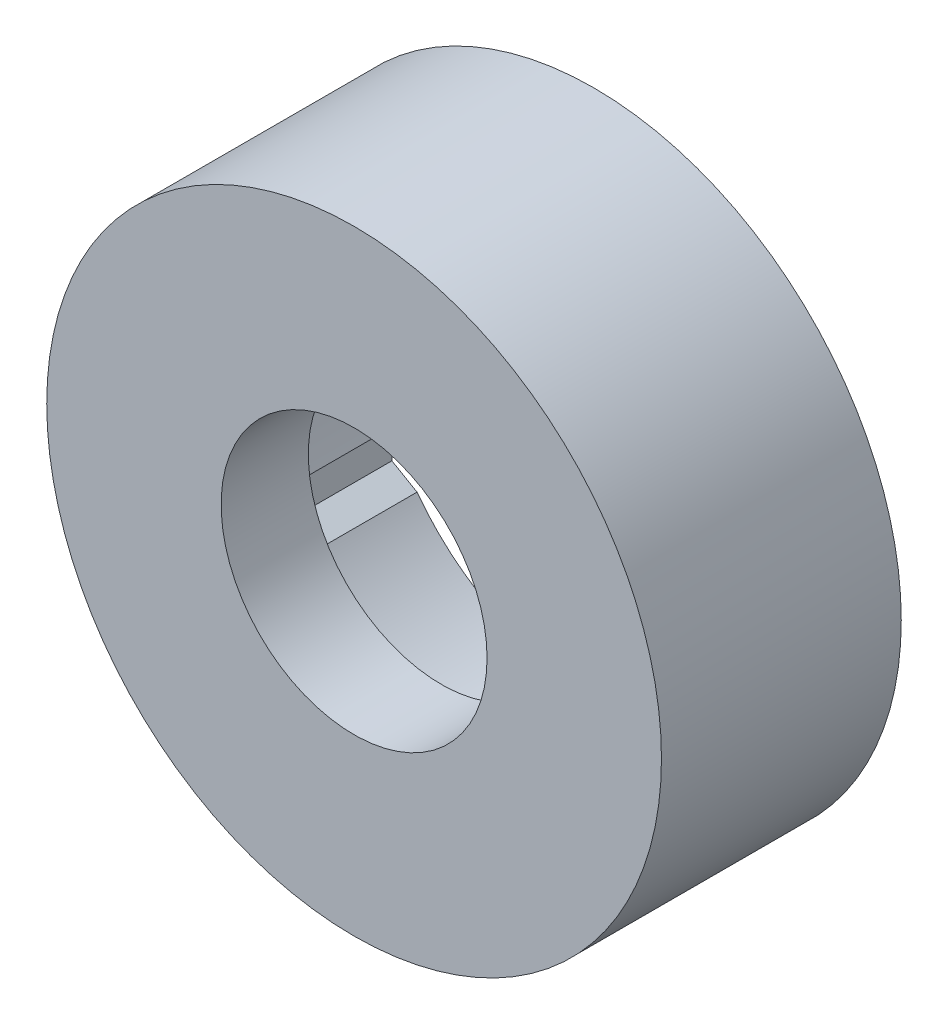
ISO-10303-21;
HEADER;
FILE_DESCRIPTION(('STEP AP214'),'2;1');
FILE_NAME('part.step','',(''),(''),'','','');
FILE_SCHEMA(('AUTOMOTIVE_DESIGN { 1 0 10303 214 1 1 1 1 }'));
ENDSEC;
DATA;
#1=APPLICATION_CONTEXT('core data for automotive mechanical design processes');
#2=APPLICATION_PROTOCOL_DEFINITION('international standard','automotive_design',2000,#1);
#3=PRODUCT_CONTEXT('',#1,'mechanical');
#4=PRODUCT('Part','Part','',(#3));
#5=PRODUCT_RELATED_PRODUCT_CATEGORY('part','',(#4));
#6=PRODUCT_DEFINITION_FORMATION('','',#4);
#7=PRODUCT_DEFINITION_CONTEXT('part definition',#1,'design');
#8=PRODUCT_DEFINITION('design','',#6,#7);
#9=PRODUCT_DEFINITION_SHAPE('','',#8);
#10=(LENGTH_UNIT() NAMED_UNIT(*) SI_UNIT(.MILLI.,.METRE.));
#11=(NAMED_UNIT(*) PLANE_ANGLE_UNIT() SI_UNIT($,.RADIAN.));
#12=(NAMED_UNIT(*) SI_UNIT($,.STERADIAN.) SOLID_ANGLE_UNIT());
#13=UNCERTAINTY_MEASURE_WITH_UNIT(LENGTH_MEASURE(1.E-05),#10,'distance_accuracy_value','');
#14=(GEOMETRIC_REPRESENTATION_CONTEXT(3) GLOBAL_UNCERTAINTY_ASSIGNED_CONTEXT((#13)) GLOBAL_UNIT_ASSIGNED_CONTEXT((#10,
#11,#12)) REPRESENTATION_CONTEXT('',''));
#15=CARTESIAN_POINT('',(0.,0.,0.));
#16=DIRECTION('',(0.,0.,1.));
#17=DIRECTION('',(1.,0.,0.));
#18=AXIS2_PLACEMENT_3D('',#15,#16,#17);
#19=CARTESIAN_POINT('',(0.,0.,-3.5));
#20=DIRECTION('',(0.,0.,1.));
#21=DIRECTION('',(1.,0.,0.));
#22=AXIS2_PLACEMENT_3D('',#19,#20,#21);
#23=CYLINDRICAL_SURFACE('',#22,5.05);
#24=CARTESIAN_POINT('',(0.,0.,-3.5));
#25=DIRECTION('',(0.,0.,1.));
#26=DIRECTION('',(1.,0.,0.));
#27=AXIS2_PLACEMENT_3D('',#24,#25,#26);
#28=CIRCLE('',#27,5.05);
#29=CARTESIAN_POINT('',(-0.57687120631193,5.01694325374807,-3.5));
#30=VERTEX_POINT('',#29);
#31=CARTESIAN_POINT('',(-4.05636470393482,3.00805674625194,-3.5));
#32=VERTEX_POINT('',#31);
#33=EDGE_CURVE('E521',#30,#32,#28,.T.);
#34=ORIENTED_EDGE('',*,*,#33,.F.);
#35=DIRECTION('',(0.,0.,-1.));
#36=VECTOR('',#35,1.);
#37=CARTESIAN_POINT('',(-0.57687120631193,5.01694325374807,1.20085317625056));
#38=LINE('',#37,#36);
#39=CARTESIAN_POINT('',(-0.57687120631193,5.01694325374807,0.));
#40=VERTEX_POINT('',#39);
#41=EDGE_CURVE('E194',#40,#30,#38,.T.);
#42=ORIENTED_EDGE('',*,*,#41,.F.);
#43=CARTESIAN_POINT('',(0.,0.,0.));
#44=DIRECTION('',(0.,0.,1.));
#45=DIRECTION('',(1.,0.,0.));
#46=AXIS2_PLACEMENT_3D('',#43,#44,#45);
#47=CIRCLE('',#46,5.05);
#48=CARTESIAN_POINT('',(-4.05636470393482,3.00805674625194,0.));
#49=VERTEX_POINT('',#48);
#50=EDGE_CURVE('E50',#40,#49,#47,.T.);
#51=ORIENTED_EDGE('',*,*,#50,.T.);
#52=DIRECTION('',(0.,0.,-1.));
#53=VECTOR('',#52,1.);
#54=CARTESIAN_POINT('',(-4.05636470393482,3.00805674625194,1.20085317625056));
#55=LINE('',#54,#53);
#56=EDGE_CURVE('E226',#49,#32,#55,.T.);
#57=ORIENTED_EDGE('',*,*,#56,.T.);
#58=EDGE_LOOP('',(#34,#42,#51,#57));
#59=FACE_BOUND('',#58,.T.);
#60=ADVANCED_FACE('F41',(#59),#23,.F.);
#61=CARTESIAN_POINT('',(-4.63323591024675,2.00888650749613,0.));
#62=VERTEX_POINT('',#61);
#63=CARTESIAN_POINT('',(-4.63323591024675,-2.00888650749613,0.));
#64=VERTEX_POINT('',#63);
#65=EDGE_CURVE('E546',#62,#64,#47,.T.);
#66=ORIENTED_EDGE('',*,*,#65,.T.);
#67=DIRECTION('',(0.,0.,-1.));
#68=VECTOR('',#67,1.);
#69=CARTESIAN_POINT('',(-4.63323591024675,-2.00888650749613,1.20085317625056));
#70=LINE('',#69,#68);
#71=CARTESIAN_POINT('',(-4.63323591024675,-2.00888650749613,-3.5));
#72=VERTEX_POINT('',#71);
#73=EDGE_CURVE('E206',#64,#72,#70,.T.);
#74=ORIENTED_EDGE('',*,*,#73,.T.);
#75=CARTESIAN_POINT('',(-4.63323591024675,2.00888650749613,-3.5));
#76=VERTEX_POINT('',#75);
#77=EDGE_CURVE('E519',#76,#72,#28,.T.);
#78=ORIENTED_EDGE('',*,*,#77,.F.);
#79=DIRECTION('',(0.,0.,-1.));
#80=VECTOR('',#79,1.);
#81=CARTESIAN_POINT('',(-4.63323591024675,2.00888650749613,1.20085317625056));
#82=LINE('',#81,#80);
#83=EDGE_CURVE('E231',#62,#76,#82,.T.);
#84=ORIENTED_EDGE('',*,*,#83,.F.);
#85=EDGE_LOOP('',(#66,#74,#78,#84));
#86=FACE_BOUND('',#85,.T.);
#87=ADVANCED_FACE('F320',(#86),#23,.F.);
#88=CARTESIAN_POINT('',(-4.05636470393482,-3.00805674625194,-3.5));
#89=VERTEX_POINT('',#88);
#90=CARTESIAN_POINT('',(-0.576871206311927,-5.01694325374807,-3.5));
#91=VERTEX_POINT('',#90);
#92=EDGE_CURVE('E514',#89,#91,#28,.T.);
#93=ORIENTED_EDGE('',*,*,#92,.F.);
#94=DIRECTION('',(0.,0.,-1.));
#95=VECTOR('',#94,1.);
#96=CARTESIAN_POINT('',(-4.05636470393482,-3.00805674625194,1.20085317625056));
#97=LINE('',#96,#95);
#98=CARTESIAN_POINT('',(-4.05636470393482,-3.00805674625194,0.));
#99=VERTEX_POINT('',#98);
#100=EDGE_CURVE('E211',#99,#89,#97,.T.);
#101=ORIENTED_EDGE('',*,*,#100,.F.);
#102=CARTESIAN_POINT('',(-0.576871206311927,-5.01694325374807,0.));
#103=VERTEX_POINT('',#102);
#104=EDGE_CURVE('E551',#99,#103,#47,.T.);
#105=ORIENTED_EDGE('',*,*,#104,.T.);
#106=DIRECTION('',(0.,0.,-1.));
#107=VECTOR('',#106,1.);
#108=CARTESIAN_POINT('',(-0.576871206311927,-5.01694325374807,1.20085317625056));
#109=LINE('',#108,#107);
#110=EDGE_CURVE('E278',#103,#91,#109,.T.);
#111=ORIENTED_EDGE('',*,*,#110,.T.);
#112=EDGE_LOOP('',(#93,#101,#105,#111));
#113=FACE_BOUND('',#112,.T.);
#114=ADVANCED_FACE('F325',(#113),#23,.F.);
#115=CARTESIAN_POINT('',(0.576871206311932,-5.01694325374807,-3.5));
#116=VERTEX_POINT('',#115);
#117=CARTESIAN_POINT('',(4.05636470393482,-3.00805674625194,-3.5));
#118=VERTEX_POINT('',#117);
#119=EDGE_CURVE('E289',#116,#118,#28,.T.);
#120=ORIENTED_EDGE('',*,*,#119,.F.);
#121=DIRECTION('',(0.,0.,-1.));
#122=VECTOR('',#121,1.);
#123=CARTESIAN_POINT('',(0.576871206311932,-5.01694325374807,1.20085317625056));
#124=LINE('',#123,#122);
#125=CARTESIAN_POINT('',(0.576871206311932,-5.01694325374807,0.));
#126=VERTEX_POINT('',#125);
#127=EDGE_CURVE('E282',#126,#116,#124,.T.);
#128=ORIENTED_EDGE('',*,*,#127,.F.);
#129=CARTESIAN_POINT('',(4.05636470393482,-3.00805674625194,0.));
#130=VERTEX_POINT('',#129);
#131=EDGE_CURVE('E295',#126,#130,#47,.T.);
#132=ORIENTED_EDGE('',*,*,#131,.T.);
#133=DIRECTION('',(0.,0.,-1.));
#134=VECTOR('',#133,1.);
#135=CARTESIAN_POINT('',(4.05636470393482,-3.00805674625194,1.20085317625056));
#136=LINE('',#135,#134);
#137=EDGE_CURVE('E263',#130,#118,#136,.T.);
#138=ORIENTED_EDGE('',*,*,#137,.T.);
#139=EDGE_LOOP('',(#120,#128,#132,#138));
#140=FACE_BOUND('',#139,.T.);
#141=ADVANCED_FACE('F448',(#140),#23,.F.);
#142=CARTESIAN_POINT('',(4.63323591024675,-2.00888650749613,-3.5));
#143=VERTEX_POINT('',#142);
#144=CARTESIAN_POINT('',(4.63323591024675,2.00888650749613,-3.5));
#145=VERTEX_POINT('',#144);
#146=EDGE_CURVE('E197',#143,#145,#28,.T.);
#147=ORIENTED_EDGE('',*,*,#146,.F.);
#148=DIRECTION('',(0.,0.,-1.));
#149=VECTOR('',#148,1.);
#150=CARTESIAN_POINT('',(4.63323591024675,-2.00888650749613,1.20085317625056));
#151=LINE('',#150,#149);
#152=CARTESIAN_POINT('',(4.63323591024675,-2.00888650749613,0.));
#153=VERTEX_POINT('',#152);
#154=EDGE_CURVE('E67',#153,#143,#151,.T.);
#155=ORIENTED_EDGE('',*,*,#154,.F.);
#156=CARTESIAN_POINT('',(4.63323591024675,2.00888650749613,0.));
#157=VERTEX_POINT('',#156);
#158=EDGE_CURVE('E52',#153,#157,#47,.T.);
#159=ORIENTED_EDGE('',*,*,#158,.T.);
#160=DIRECTION('',(0.,0.,-1.));
#161=VECTOR('',#160,1.);
#162=CARTESIAN_POINT('',(4.63323591024675,2.00888650749613,1.20085317625056));
#163=LINE('',#162,#161);
#164=EDGE_CURVE('E246',#157,#145,#163,.T.);
#165=ORIENTED_EDGE('',*,*,#164,.T.);
#166=EDGE_LOOP('',(#147,#155,#159,#165));
#167=FACE_BOUND('',#166,.T.);
#168=ADVANCED_FACE('F317',(#167),#23,.F.);
#169=CARTESIAN_POINT('',(0.,0.,0.));
#170=DIRECTION('',(0.,0.,1.));
#171=DIRECTION('',(1.,0.,0.));
#172=AXIS2_PLACEMENT_3D('',#169,#170,#171);
#173=PLANE('',#172);
#174=CARTESIAN_POINT('',(0.,0.,0.));
#175=DIRECTION('',(0.,0.,1.));
#176=DIRECTION('',(1.,0.,0.));
#177=AXIS2_PLACEMENT_3D('',#174,#175,#176);
#178=CIRCLE('',#177,3.05);
#179=CARTESIAN_POINT('',(3.05,0.,0.));
#180=VERTEX_POINT('',#179);
#181=EDGE_CURVE('E45',#180,#180,#178,.T.);
#182=ORIENTED_EDGE('',*,*,#181,.T.);
#183=EDGE_LOOP('',(#182));
#184=FACE_BOUND('',#183,.T.);
#185=CARTESIAN_POINT('',(4.05636470393482,3.00805674625194,0.));
#186=VERTEX_POINT('',#185);
#187=CARTESIAN_POINT('',(0.576871206311929,5.01694325374807,0.));
#188=VERTEX_POINT('',#187);
#189=EDGE_CURVE('E11',#186,#188,#47,.T.);
#190=ORIENTED_EDGE('',*,*,#189,.F.);
#191=DIRECTION('',(0.866025403784439,-0.5,0.));
#192=VECTOR('',#191,1.);
#193=CARTESIAN_POINT('',(2.31661795512337,4.0125,0.));
#194=LINE('',#193,#192);
#195=CARTESIAN_POINT('',(4.63323591024675,2.675,0.));
#196=VERTEX_POINT('',#195);
#197=EDGE_CURVE('E247',#186,#196,#194,.T.);
#198=ORIENTED_EDGE('',*,*,#197,.T.);
#199=DIRECTION('',(0.,-1.,0.));
#200=VECTOR('',#199,1.);
#201=CARTESIAN_POINT('',(4.63323591024675,0.,0.));
#202=LINE('',#201,#200);
#203=EDGE_CURVE('E239',#196,#157,#202,.T.);
#204=ORIENTED_EDGE('',*,*,#203,.T.);
#205=ORIENTED_EDGE('',*,*,#158,.F.);
#206=DIRECTION('',(0.,-1.,0.));
#207=VECTOR('',#206,1.);
#208=CARTESIAN_POINT('',(4.63323591024675,0.,0.));
#209=LINE('',#208,#207);
#210=CARTESIAN_POINT('',(4.63323591024675,-2.675,0.));
#211=VERTEX_POINT('',#210);
#212=EDGE_CURVE('E264',#153,#211,#209,.T.);
#213=ORIENTED_EDGE('',*,*,#212,.T.);
#214=DIRECTION('',(-0.866025403784439,-0.5,0.));
#215=VECTOR('',#214,1.);
#216=CARTESIAN_POINT('',(2.31661795512337,-4.0125,0.));
#217=LINE('',#216,#215);
#218=EDGE_CURVE('E257',#211,#130,#217,.T.);
#219=ORIENTED_EDGE('',*,*,#218,.T.);
#220=ORIENTED_EDGE('',*,*,#131,.F.);
#221=DIRECTION('',(-0.866025403784439,-0.5,0.));
#222=VECTOR('',#221,1.);
#223=CARTESIAN_POINT('',(2.31661795512337,-4.0125,0.));
#224=LINE('',#223,#222);
#225=CARTESIAN_POINT('',(0.,-5.35,0.));
#226=VERTEX_POINT('',#225);
#227=EDGE_CURVE('E279',#126,#226,#224,.T.);
#228=ORIENTED_EDGE('',*,*,#227,.T.);
#229=DIRECTION('',(-0.866025403784439,0.5,0.));
#230=VECTOR('',#229,1.);
#231=CARTESIAN_POINT('',(-2.31661795512337,-4.0125,0.));
#232=LINE('',#231,#230);
#233=EDGE_CURVE('E273',#226,#103,#232,.T.);
#234=ORIENTED_EDGE('',*,*,#233,.T.);
#235=ORIENTED_EDGE('',*,*,#104,.F.);
#236=DIRECTION('',(-0.866025403784439,0.5,0.));
#237=VECTOR('',#236,1.);
#238=CARTESIAN_POINT('',(-2.31661795512337,-4.0125,0.));
#239=LINE('',#238,#237);
#240=CARTESIAN_POINT('',(-4.63323591024675,-2.675,0.));
#241=VERTEX_POINT('',#240);
#242=EDGE_CURVE('E207',#99,#241,#239,.T.);
#243=ORIENTED_EDGE('',*,*,#242,.T.);
#244=DIRECTION('',(0.,1.,0.));
#245=VECTOR('',#244,1.);
#246=CARTESIAN_POINT('',(-4.63323591024675,0.,0.));
#247=LINE('',#246,#245);
#248=EDGE_CURVE('E200',#241,#64,#247,.T.);
#249=ORIENTED_EDGE('',*,*,#248,.T.);
#250=ORIENTED_EDGE('',*,*,#65,.F.);
#251=DIRECTION('',(0.,1.,0.));
#252=VECTOR('',#251,1.);
#253=CARTESIAN_POINT('',(-4.63323591024675,0.,0.));
#254=LINE('',#253,#252);
#255=CARTESIAN_POINT('',(-4.63323591024675,2.675,0.));
#256=VERTEX_POINT('',#255);
#257=EDGE_CURVE('E227',#62,#256,#254,.T.);
#258=ORIENTED_EDGE('',*,*,#257,.T.);
#259=DIRECTION('',(0.866025403784439,0.5,0.));
#260=VECTOR('',#259,1.);
#261=CARTESIAN_POINT('',(-2.31661795512337,4.0125,0.));
#262=LINE('',#261,#260);
#263=EDGE_CURVE('E219',#256,#49,#262,.T.);
#264=ORIENTED_EDGE('',*,*,#263,.T.);
#265=ORIENTED_EDGE('',*,*,#50,.F.);
#266=DIRECTION('',(0.866025403784439,0.5,0.));
#267=VECTOR('',#266,1.);
#268=CARTESIAN_POINT('',(-2.31661795512337,4.0125,0.));
#269=LINE('',#268,#267);
#270=CARTESIAN_POINT('',(0.,5.35,0.));
#271=VERTEX_POINT('',#270);
#272=EDGE_CURVE('E182',#40,#271,#269,.T.);
#273=ORIENTED_EDGE('',*,*,#272,.T.);
#274=DIRECTION('',(0.866025403784439,-0.5,0.));
#275=VECTOR('',#274,1.);
#276=CARTESIAN_POINT('',(2.31661795512337,4.0125,0.));
#277=LINE('',#276,#275);
#278=EDGE_CURVE('E171',#271,#188,#277,.T.);
#279=ORIENTED_EDGE('',*,*,#278,.T.);
#280=EDGE_LOOP('',(#190,#198,#204,#205,#213,#219,#220,#228,#234,#235,#243,#249,#250,#258,#264,
#265,#273,#279));
#281=FACE_BOUND('',#280,.T.);
#282=ADVANCED_FACE('F186',(#184,#281),#173,.F.);
#283=CARTESIAN_POINT('',(0.,0.,2.));
#284=DIRECTION('',(0.,0.,-1.));
#285=DIRECTION('',(-1.,0.,0.));
#286=AXIS2_PLACEMENT_3D('',#283,#284,#285);
#287=CYLINDRICAL_SURFACE('',#286,7.05);
#288=CARTESIAN_POINT('',(0.,0.,2.));
#289=DIRECTION('',(0.,0.,1.));
#290=DIRECTION('',(1.,0.,0.));
#291=AXIS2_PLACEMENT_3D('',#288,#289,#290);
#292=CIRCLE('',#291,7.05);
#293=CARTESIAN_POINT('',(7.05,0.,2.));
#294=VERTEX_POINT('',#293);
#295=EDGE_CURVE('E297',#294,#294,#292,.T.);
#296=ORIENTED_EDGE('',*,*,#295,.F.);
#297=EDGE_LOOP('',(#296));
#298=FACE_BOUND('',#297,.T.);
#299=CARTESIAN_POINT('',(0.,0.,-3.5));
#300=DIRECTION('',(0.,0.,1.));
#301=DIRECTION('',(1.,0.,0.));
#302=AXIS2_PLACEMENT_3D('',#299,#300,#301);
#303=CIRCLE('',#302,7.05);
#304=CARTESIAN_POINT('',(7.05,0.,-3.5));
#305=VERTEX_POINT('',#304);
#306=EDGE_CURVE('E291',#305,#305,#303,.T.);
#307=ORIENTED_EDGE('',*,*,#306,.T.);
#308=EDGE_LOOP('',(#307));
#309=FACE_BOUND('',#308,.T.);
#310=ADVANCED_FACE('F43',(#298,#309),#287,.T.);
#311=CARTESIAN_POINT('',(0.,0.,2.));
#312=DIRECTION('',(0.,0.,-1.));
#313=DIRECTION('',(-1.,0.,0.));
#314=AXIS2_PLACEMENT_3D('',#311,#312,#313);
#315=CYLINDRICAL_SURFACE('',#314,3.05);
#316=CARTESIAN_POINT('',(0.,0.,2.));
#317=DIRECTION('',(0.,0.,1.));
#318=DIRECTION('',(1.,0.,0.));
#319=AXIS2_PLACEMENT_3D('',#316,#317,#318);
#320=CIRCLE('',#319,3.05);
#321=CARTESIAN_POINT('',(3.05,0.,2.));
#322=VERTEX_POINT('',#321);
#323=EDGE_CURVE('E296',#322,#322,#320,.T.);
#324=ORIENTED_EDGE('',*,*,#323,.T.);
#325=EDGE_LOOP('',(#324));
#326=FACE_BOUND('',#325,.T.);
#327=ORIENTED_EDGE('',*,*,#181,.F.);
#328=EDGE_LOOP('',(#327));
#329=FACE_BOUND('',#328,.T.);
#330=ADVANCED_FACE('F302',(#326,#329),#315,.F.);
#331=CARTESIAN_POINT('',(0.,0.,2.));
#332=DIRECTION('',(0.,0.,1.));
#333=DIRECTION('',(1.,0.,0.));
#334=AXIS2_PLACEMENT_3D('',#331,#332,#333);
#335=PLANE('',#334);
#336=ORIENTED_EDGE('',*,*,#295,.T.);
#337=EDGE_LOOP('',(#336));
#338=FACE_BOUND('',#337,.T.);
#339=ORIENTED_EDGE('',*,*,#323,.F.);
#340=EDGE_LOOP('',(#339));
#341=FACE_BOUND('',#340,.T.);
#342=ADVANCED_FACE('F305',(#338,#341),#335,.T.);
#343=ORIENTED_EDGE('',*,*,#189,.T.);
#344=DIRECTION('',(0.,0.,-1.));
#345=VECTOR('',#344,1.);
#346=CARTESIAN_POINT('',(0.576871206311929,5.01694325374807,1.20085317625056));
#347=LINE('',#346,#345);
#348=CARTESIAN_POINT('',(0.576871206311929,5.01694325374807,-3.5));
#349=VERTEX_POINT('',#348);
#350=EDGE_CURVE('E176',#188,#349,#347,.T.);
#351=ORIENTED_EDGE('',*,*,#350,.T.);
#352=CARTESIAN_POINT('',(4.05636470393482,3.00805674625194,-3.5));
#353=VERTEX_POINT('',#352);
#354=EDGE_CURVE('E290',#353,#349,#28,.T.);
#355=ORIENTED_EDGE('',*,*,#354,.F.);
#356=DIRECTION('',(0.,0.,-1.));
#357=VECTOR('',#356,1.);
#358=CARTESIAN_POINT('',(4.05636470393482,3.00805674625194,1.20085317625056));
#359=LINE('',#358,#357);
#360=EDGE_CURVE('E250',#186,#353,#359,.T.);
#361=ORIENTED_EDGE('',*,*,#360,.F.);
#362=EDGE_LOOP('',(#343,#351,#355,#361));
#363=FACE_BOUND('',#362,.T.);
#364=ADVANCED_FACE('F307',(#363),#23,.F.);
#365=CARTESIAN_POINT('',(0.,0.,-3.5));
#366=DIRECTION('',(0.,0.,1.));
#367=DIRECTION('',(1.,0.,0.));
#368=AXIS2_PLACEMENT_3D('',#365,#366,#367);
#369=PLANE('',#368);
#370=DIRECTION('',(0.866025403784439,-0.5,0.));
#371=VECTOR('',#370,1.);
#372=CARTESIAN_POINT('',(2.31661795512337,4.0125,-3.5));
#373=LINE('',#372,#371);
#374=CARTESIAN_POINT('',(0.,5.35,-3.5));
#375=VERTEX_POINT('',#374);
#376=EDGE_CURVE('E189',#375,#349,#373,.T.);
#377=ORIENTED_EDGE('',*,*,#376,.F.);
#378=DIRECTION('',(0.866025403784439,0.5,0.));
#379=VECTOR('',#378,1.);
#380=CARTESIAN_POINT('',(-2.31661795512337,4.0125,-3.5));
#381=LINE('',#380,#379);
#382=EDGE_CURVE('E59',#30,#375,#381,.T.);
#383=ORIENTED_EDGE('',*,*,#382,.F.);
#384=ORIENTED_EDGE('',*,*,#33,.T.);
#385=DIRECTION('',(0.866025403784439,0.5,0.));
#386=VECTOR('',#385,1.);
#387=CARTESIAN_POINT('',(-2.31661795512337,4.0125,-3.5));
#388=LINE('',#387,#386);
#389=CARTESIAN_POINT('',(-4.63323591024675,2.675,-3.5));
#390=VERTEX_POINT('',#389);
#391=EDGE_CURVE('E217',#390,#32,#388,.T.);
#392=ORIENTED_EDGE('',*,*,#391,.F.);
#393=DIRECTION('',(0.,1.,0.));
#394=VECTOR('',#393,1.);
#395=CARTESIAN_POINT('',(-4.63323591024675,0.,-3.5));
#396=LINE('',#395,#394);
#397=EDGE_CURVE('E220',#76,#390,#396,.T.);
#398=ORIENTED_EDGE('',*,*,#397,.F.);
#399=ORIENTED_EDGE('',*,*,#77,.T.);
#400=DIRECTION('',(0.,1.,0.));
#401=VECTOR('',#400,1.);
#402=CARTESIAN_POINT('',(-4.63323591024675,0.,-3.5));
#403=LINE('',#402,#401);
#404=CARTESIAN_POINT('',(-4.63323591024675,-2.675,-3.5));
#405=VERTEX_POINT('',#404);
#406=EDGE_CURVE('E198',#405,#72,#403,.T.);
#407=ORIENTED_EDGE('',*,*,#406,.F.);
#408=DIRECTION('',(-0.866025403784439,0.5,0.));
#409=VECTOR('',#408,1.);
#410=CARTESIAN_POINT('',(-2.31661795512337,-4.0125,-3.5));
#411=LINE('',#410,#409);
#412=EDGE_CURVE('E201',#89,#405,#411,.T.);
#413=ORIENTED_EDGE('',*,*,#412,.F.);
#414=ORIENTED_EDGE('',*,*,#92,.T.);
#415=DIRECTION('',(-0.866025403784439,0.5,0.));
#416=VECTOR('',#415,1.);
#417=CARTESIAN_POINT('',(-2.31661795512337,-4.0125,-3.5));
#418=LINE('',#417,#416);
#419=CARTESIAN_POINT('',(0.,-5.35,-3.5));
#420=VERTEX_POINT('',#419);
#421=EDGE_CURVE('E271',#420,#91,#418,.T.);
#422=ORIENTED_EDGE('',*,*,#421,.F.);
#423=DIRECTION('',(-0.866025403784439,-0.5,0.));
#424=VECTOR('',#423,1.);
#425=CARTESIAN_POINT('',(2.31661795512337,-4.0125,-3.5));
#426=LINE('',#425,#424);
#427=EDGE_CURVE('E216',#116,#420,#426,.T.);
#428=ORIENTED_EDGE('',*,*,#427,.F.);
#429=ORIENTED_EDGE('',*,*,#119,.T.);
#430=DIRECTION('',(-0.866025403784439,-0.5,0.));
#431=VECTOR('',#430,1.);
#432=CARTESIAN_POINT('',(2.31661795512337,-4.0125,-3.5));
#433=LINE('',#432,#431);
#434=CARTESIAN_POINT('',(4.63323591024675,-2.675,-3.5));
#435=VERTEX_POINT('',#434);
#436=EDGE_CURVE('E255',#435,#118,#433,.T.);
#437=ORIENTED_EDGE('',*,*,#436,.F.);
#438=DIRECTION('',(0.,-1.,0.));
#439=VECTOR('',#438,1.);
#440=CARTESIAN_POINT('',(4.63323591024675,0.,-3.5));
#441=LINE('',#440,#439);
#442=EDGE_CURVE('E258',#143,#435,#441,.T.);
#443=ORIENTED_EDGE('',*,*,#442,.F.);
#444=ORIENTED_EDGE('',*,*,#146,.T.);
#445=DIRECTION('',(0.,-1.,0.));
#446=VECTOR('',#445,1.);
#447=CARTESIAN_POINT('',(4.63323591024675,0.,-3.5));
#448=LINE('',#447,#446);
#449=CARTESIAN_POINT('',(4.63323591024675,2.675,-3.5));
#450=VERTEX_POINT('',#449);
#451=EDGE_CURVE('E237',#450,#145,#448,.T.);
#452=ORIENTED_EDGE('',*,*,#451,.F.);
#453=DIRECTION('',(0.866025403784439,-0.5,0.));
#454=VECTOR('',#453,1.);
#455=CARTESIAN_POINT('',(2.31661795512337,4.0125,-3.5));
#456=LINE('',#455,#454);
#457=EDGE_CURVE('E240',#353,#450,#456,.T.);
#458=ORIENTED_EDGE('',*,*,#457,.F.);
#459=ORIENTED_EDGE('',*,*,#354,.T.);
#460=EDGE_LOOP('',(#377,#383,#384,#392,#398,#399,#407,#413,#414,#422,#428,#429,#437,#443,#444,
#452,#458,#459));
#461=FACE_BOUND('',#460,.T.);
#462=ORIENTED_EDGE('',*,*,#306,.F.);
#463=EDGE_LOOP('',(#462));
#464=FACE_BOUND('',#463,.T.);
#465=ADVANCED_FACE('F314',(#461,#464),#369,.F.);
#466=CARTESIAN_POINT('',(-2.31661795512337,4.0125,1.20085317625056));
#467=DIRECTION('',(-0.5,0.866025403784439,0.));
#468=DIRECTION('',(-0.866025403784439,-0.5,0.));
#469=AXIS2_PLACEMENT_3D('',#466,#467,#468);
#470=PLANE('',#469);
#471=DIRECTION('',(0.,0.,-1.));
#472=VECTOR('',#471,1.);
#473=CARTESIAN_POINT('',(-4.63323591024675,2.675,1.20085317625056));
#474=LINE('',#473,#472);
#475=EDGE_CURVE('E230',#256,#390,#474,.T.);
#476=ORIENTED_EDGE('',*,*,#475,.T.);
#477=ORIENTED_EDGE('',*,*,#391,.T.);
#478=ORIENTED_EDGE('',*,*,#56,.F.);
#479=ORIENTED_EDGE('',*,*,#263,.F.);
#480=EDGE_LOOP('',(#476,#477,#478,#479));
#481=FACE_BOUND('',#480,.T.);
#482=ADVANCED_FACE('F331',(#481),#470,.F.);
#483=CARTESIAN_POINT('',(-4.63323591024675,0.,1.20085317625056));
#484=DIRECTION('',(-1.,0.,0.));
#485=DIRECTION('',(0.,0.,1.));
#486=AXIS2_PLACEMENT_3D('',#483,#484,#485);
#487=PLANE('',#486);
#488=ORIENTED_EDGE('',*,*,#83,.T.);
#489=ORIENTED_EDGE('',*,*,#397,.T.);
#490=ORIENTED_EDGE('',*,*,#475,.F.);
#491=ORIENTED_EDGE('',*,*,#257,.F.);
#492=EDGE_LOOP('',(#488,#489,#490,#491));
#493=FACE_BOUND('',#492,.T.);
#494=ADVANCED_FACE('F353',(#493),#487,.F.);
#495=CARTESIAN_POINT('',(4.63323591024675,0.,1.20085317625056));
#496=DIRECTION('',(1.,0.,0.));
#497=DIRECTION('',(0.,0.,-1.));
#498=AXIS2_PLACEMENT_3D('',#495,#496,#497);
#499=PLANE('',#498);
#500=DIRECTION('',(0.,0.,-1.));
#501=VECTOR('',#500,1.);
#502=CARTESIAN_POINT('',(4.63323591024675,2.675,1.20085317625056));
#503=LINE('',#502,#501);
#504=EDGE_CURVE('E223',#196,#450,#503,.T.);
#505=ORIENTED_EDGE('',*,*,#504,.T.);
#506=ORIENTED_EDGE('',*,*,#451,.T.);
#507=ORIENTED_EDGE('',*,*,#164,.F.);
#508=ORIENTED_EDGE('',*,*,#203,.F.);
#509=EDGE_LOOP('',(#505,#506,#507,#508));
#510=FACE_BOUND('',#509,.T.);
#511=ADVANCED_FACE('F350',(#510),#499,.F.);
#512=CARTESIAN_POINT('',(2.31661795512337,4.0125,1.20085317625056));
#513=DIRECTION('',(0.5,0.866025403784438,0.));
#514=DIRECTION('',(-0.866025403784439,0.5,0.));
#515=AXIS2_PLACEMENT_3D('',#512,#513,#514);
#516=PLANE('',#515);
#517=ORIENTED_EDGE('',*,*,#360,.T.);
#518=ORIENTED_EDGE('',*,*,#457,.T.);
#519=ORIENTED_EDGE('',*,*,#504,.F.);
#520=ORIENTED_EDGE('',*,*,#197,.F.);
#521=EDGE_LOOP('',(#517,#518,#519,#520));
#522=FACE_BOUND('',#521,.T.);
#523=ADVANCED_FACE('F346',(#522),#516,.F.);
#524=CARTESIAN_POINT('',(2.31661795512337,-4.0125,1.20085317625056));
#525=DIRECTION('',(0.5,-0.866025403784439,0.));
#526=DIRECTION('',(0.866025403784439,0.5,0.));
#527=AXIS2_PLACEMENT_3D('',#524,#525,#526);
#528=PLANE('',#527);
#529=DIRECTION('',(0.,0.,-1.));
#530=VECTOR('',#529,1.);
#531=CARTESIAN_POINT('',(4.63323591024675,-2.675,1.20085317625056));
#532=LINE('',#531,#530);
#533=EDGE_CURVE('E243',#211,#435,#532,.T.);
#534=ORIENTED_EDGE('',*,*,#533,.T.);
#535=ORIENTED_EDGE('',*,*,#436,.T.);
#536=ORIENTED_EDGE('',*,*,#137,.F.);
#537=ORIENTED_EDGE('',*,*,#218,.F.);
#538=EDGE_LOOP('',(#534,#535,#536,#537));
#539=FACE_BOUND('',#538,.T.);
#540=ADVANCED_FACE('F343',(#539),#528,.F.);
#541=CARTESIAN_POINT('',(4.63323591024675,0.,1.20085317625056));
#542=DIRECTION('',(1.,0.,0.));
#543=DIRECTION('',(0.,0.,-1.));
#544=AXIS2_PLACEMENT_3D('',#541,#542,#543);
#545=PLANE('',#544);
#546=ORIENTED_EDGE('',*,*,#154,.T.);
#547=ORIENTED_EDGE('',*,*,#442,.T.);
#548=ORIENTED_EDGE('',*,*,#533,.F.);
#549=ORIENTED_EDGE('',*,*,#212,.F.);
#550=EDGE_LOOP('',(#546,#547,#548,#549));
#551=FACE_BOUND('',#550,.T.);
#552=ADVANCED_FACE('F337',(#551),#545,.F.);
#553=CARTESIAN_POINT('',(-2.31661795512337,-4.0125,1.20085317625056));
#554=DIRECTION('',(-0.5,-0.866025403784438,0.));
#555=DIRECTION('',(0.866025403784439,-0.5,0.));
#556=AXIS2_PLACEMENT_3D('',#553,#554,#555);
#557=PLANE('',#556);
#558=DIRECTION('',(0.,0.,-1.));
#559=VECTOR('',#558,1.);
#560=CARTESIAN_POINT('',(0.,-5.35,1.20085317625056));
#561=LINE('',#560,#559);
#562=EDGE_CURVE('E260',#226,#420,#561,.T.);
#563=ORIENTED_EDGE('',*,*,#562,.T.);
#564=ORIENTED_EDGE('',*,*,#421,.T.);
#565=ORIENTED_EDGE('',*,*,#110,.F.);
#566=ORIENTED_EDGE('',*,*,#233,.F.);
#567=EDGE_LOOP('',(#563,#564,#565,#566));
#568=FACE_BOUND('',#567,.T.);
#569=ADVANCED_FACE('F333',(#568),#557,.F.);
#570=CARTESIAN_POINT('',(2.31661795512337,-4.0125,1.20085317625056));
#571=DIRECTION('',(0.5,-0.866025403784439,0.));
#572=DIRECTION('',(0.866025403784439,0.5,0.));
#573=AXIS2_PLACEMENT_3D('',#570,#571,#572);
#574=PLANE('',#573);
#575=ORIENTED_EDGE('',*,*,#127,.T.);
#576=ORIENTED_EDGE('',*,*,#427,.T.);
#577=ORIENTED_EDGE('',*,*,#562,.F.);
#578=ORIENTED_EDGE('',*,*,#227,.F.);
#579=EDGE_LOOP('',(#575,#576,#577,#578));
#580=FACE_BOUND('',#579,.T.);
#581=ADVANCED_FACE('F336',(#580),#574,.F.);
#582=CARTESIAN_POINT('',(-4.63323591024675,0.,1.20085317625056));
#583=DIRECTION('',(-1.,0.,0.));
#584=DIRECTION('',(0.,0.,1.));
#585=AXIS2_PLACEMENT_3D('',#582,#583,#584);
#586=PLANE('',#585);
#587=DIRECTION('',(0.,0.,-1.));
#588=VECTOR('',#587,1.);
#589=CARTESIAN_POINT('',(-4.63323591024675,-2.675,1.20085317625056));
#590=LINE('',#589,#588);
#591=EDGE_CURVE('E210',#241,#405,#590,.T.);
#592=ORIENTED_EDGE('',*,*,#591,.T.);
#593=ORIENTED_EDGE('',*,*,#406,.T.);
#594=ORIENTED_EDGE('',*,*,#73,.F.);
#595=ORIENTED_EDGE('',*,*,#248,.F.);
#596=EDGE_LOOP('',(#592,#593,#594,#595));
#597=FACE_BOUND('',#596,.T.);
#598=ADVANCED_FACE('F341',(#597),#586,.F.);
#599=CARTESIAN_POINT('',(-2.31661795512337,-4.0125,1.20085317625056));
#600=DIRECTION('',(-0.5,-0.866025403784438,0.));
#601=DIRECTION('',(0.866025403784439,-0.5,0.));
#602=AXIS2_PLACEMENT_3D('',#599,#600,#601);
#603=PLANE('',#602);
#604=ORIENTED_EDGE('',*,*,#100,.T.);
#605=ORIENTED_EDGE('',*,*,#412,.T.);
#606=ORIENTED_EDGE('',*,*,#591,.F.);
#607=ORIENTED_EDGE('',*,*,#242,.F.);
#608=EDGE_LOOP('',(#604,#605,#606,#607));
#609=FACE_BOUND('',#608,.T.);
#610=ADVANCED_FACE('F366',(#609),#603,.F.);
#611=CARTESIAN_POINT('',(-2.31661795512337,4.0125,1.20085317625056));
#612=DIRECTION('',(-0.5,0.866025403784439,0.));
#613=DIRECTION('',(-0.866025403784439,-0.5,0.));
#614=AXIS2_PLACEMENT_3D('',#611,#612,#613);
#615=PLANE('',#614);
#616=ORIENTED_EDGE('',*,*,#41,.T.);
#617=ORIENTED_EDGE('',*,*,#382,.T.);
#618=DIRECTION('',(0.,0.,-1.));
#619=VECTOR('',#618,1.);
#620=CARTESIAN_POINT('',(0.,5.35,1.20085317625056));
#621=LINE('',#620,#619);
#622=EDGE_CURVE('E173',#271,#375,#621,.T.);
#623=ORIENTED_EDGE('',*,*,#622,.F.);
#624=ORIENTED_EDGE('',*,*,#272,.F.);
#625=EDGE_LOOP('',(#616,#617,#623,#624));
#626=FACE_BOUND('',#625,.T.);
#627=ADVANCED_FACE('F181',(#626),#615,.F.);
#628=CARTESIAN_POINT('',(2.31661795512337,4.0125,1.20085317625056));
#629=DIRECTION('',(0.5,0.866025403784438,0.));
#630=DIRECTION('',(-0.866025403784439,0.5,0.));
#631=AXIS2_PLACEMENT_3D('',#628,#629,#630);
#632=PLANE('',#631);
#633=ORIENTED_EDGE('',*,*,#622,.T.);
#634=ORIENTED_EDGE('',*,*,#376,.T.);
#635=ORIENTED_EDGE('',*,*,#350,.F.);
#636=ORIENTED_EDGE('',*,*,#278,.F.);
#637=EDGE_LOOP('',(#633,#634,#635,#636));
#638=FACE_BOUND('',#637,.T.);
#639=ADVANCED_FACE('F172',(#638),#632,.F.);
#640=CLOSED_SHELL('',(#60,#87,#114,#141,#168,#282,#310,#330,#342,#364,#465,#482,#494,#511,#523,
#540,#552,#569,#581,#598,#610,#627,#639));
#641=MANIFOLD_SOLID_BREP('B2',#640);
#642=ADVANCED_BREP_SHAPE_REPRESENTATION('',(#18,#641),#14);
#643=SHAPE_DEFINITION_REPRESENTATION(#9,#642);
ENDSEC;
END-ISO-10303-21;
